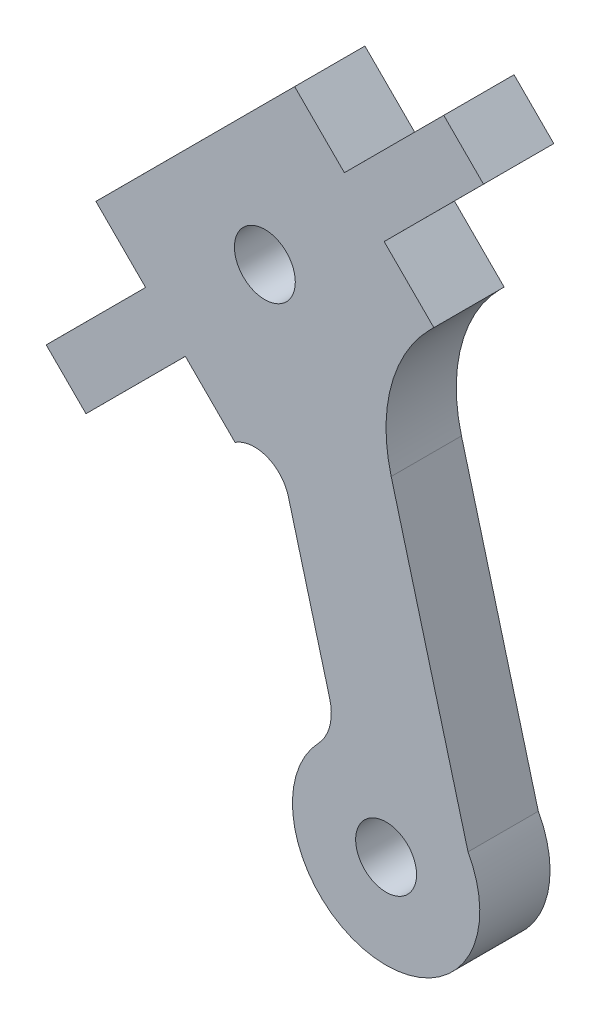
ISO-10303-21;
HEADER;
FILE_DESCRIPTION(('STEP AP214'),'2;1');
FILE_NAME('part.step','',(''),(''),'','','');
FILE_SCHEMA(('AUTOMOTIVE_DESIGN { 1 0 10303 214 1 1 1 1 }'));
ENDSEC;
DATA;
#1=APPLICATION_CONTEXT('core data for automotive mechanical design processes');
#2=APPLICATION_PROTOCOL_DEFINITION('international standard','automotive_design',2000,#1);
#3=PRODUCT_CONTEXT('',#1,'mechanical');
#4=PRODUCT('Part','Part','',(#3));
#5=PRODUCT_RELATED_PRODUCT_CATEGORY('part','',(#4));
#6=PRODUCT_DEFINITION_FORMATION('','',#4);
#7=PRODUCT_DEFINITION_CONTEXT('part definition',#1,'design');
#8=PRODUCT_DEFINITION('design','',#6,#7);
#9=PRODUCT_DEFINITION_SHAPE('','',#8);
#10=(LENGTH_UNIT() NAMED_UNIT(*) SI_UNIT(.MILLI.,.METRE.));
#11=(NAMED_UNIT(*) PLANE_ANGLE_UNIT() SI_UNIT($,.RADIAN.));
#12=(NAMED_UNIT(*) SI_UNIT($,.STERADIAN.) SOLID_ANGLE_UNIT());
#13=UNCERTAINTY_MEASURE_WITH_UNIT(LENGTH_MEASURE(1.E-05),#10,'distance_accuracy_value','');
#14=(GEOMETRIC_REPRESENTATION_CONTEXT(3) GLOBAL_UNCERTAINTY_ASSIGNED_CONTEXT((#13)) GLOBAL_UNIT_ASSIGNED_CONTEXT((#10,
#11,#12)) REPRESENTATION_CONTEXT('',''));
#15=CARTESIAN_POINT('',(0.,0.,0.));
#16=DIRECTION('',(0.,0.,1.));
#17=DIRECTION('',(1.,0.,0.));
#18=AXIS2_PLACEMENT_3D('',#15,#16,#17);
#19=CARTESIAN_POINT('',(8.71249984001849,3.27495155834081,-0.36285766747514));
#20=DIRECTION('',(0.,0.,-1.));
#21=DIRECTION('',(-1.,0.,0.));
#22=AXIS2_PLACEMENT_3D('',#19,#20,#21);
#23=CYLINDRICAL_SURFACE('',#22,3.9989046951601);
#24=CARTESIAN_POINT('',(8.71249984001849,3.27495155834081,-3.36285766747514));
#25=DIRECTION('',(0.,0.,-1.));
#26=DIRECTION('',(-1.,0.,0.));
#27=AXIS2_PLACEMENT_3D('',#24,#25,#26);
#28=CIRCLE('',#27,3.9989046951601);
#29=CARTESIAN_POINT('',(12.2085349080239,5.21633703378103,-3.36285766747514));
#30=VERTEX_POINT('',#29);
#31=CARTESIAN_POINT('',(5.81930803299026,6.03550946005528,-3.36285766747514));
#32=VERTEX_POINT('',#31);
#33=EDGE_CURVE('E193',#30,#32,#28,.T.);
#34=ORIENTED_EDGE('',*,*,#33,.F.);
#35=DIRECTION('',(0.,0.,-1.));
#36=VECTOR('',#35,1.);
#37=CARTESIAN_POINT('',(12.2085349080239,5.21633703378103,-0.36285766747514));
#38=LINE('',#37,#36);
#39=CARTESIAN_POINT('',(12.2085349080239,5.21633703378103,-0.36285766747514));
#40=VERTEX_POINT('',#39);
#41=EDGE_CURVE('E11',#40,#30,#38,.T.);
#42=ORIENTED_EDGE('',*,*,#41,.F.);
#43=CARTESIAN_POINT('',(8.71249984001849,3.27495155834081,-0.36285766747514));
#44=DIRECTION('',(0.,0.,-1.));
#45=DIRECTION('',(-1.,0.,0.));
#46=AXIS2_PLACEMENT_3D('',#43,#44,#45);
#47=CIRCLE('',#46,3.9989046951601);
#48=CARTESIAN_POINT('',(5.81930803299026,6.03550946005528,-0.36285766747514));
#49=VERTEX_POINT('',#48);
#50=EDGE_CURVE('E244',#40,#49,#47,.T.);
#51=ORIENTED_EDGE('',*,*,#50,.T.);
#52=DIRECTION('',(0.,0.,-1.));
#53=VECTOR('',#52,1.);
#54=CARTESIAN_POINT('',(5.81930803299026,6.03550946005528,-0.36285766747514));
#55=LINE('',#54,#53);
#56=EDGE_CURVE('E39',#49,#32,#55,.T.);
#57=ORIENTED_EDGE('',*,*,#56,.T.);
#58=EDGE_LOOP('',(#34,#42,#51,#57));
#59=FACE_BOUND('',#58,.T.);
#60=ADVANCED_FACE('F36',(#59),#23,.T.);
#61=CARTESIAN_POINT('',(8.92945698731412,17.453301020098,-0.36285766747514));
#62=DIRECTION('',(0.965922011606497,0.258833281272055,0.));
#63=DIRECTION('',(-0.258833281272055,0.965922011606497,0.));
#64=AXIS2_PLACEMENT_3D('',#61,#62,#63);
#65=PLANE('',#64);
#66=DIRECTION('',(0.258833281272055,-0.965922011606497,0.));
#67=VECTOR('',#66,1.);
#68=CARTESIAN_POINT('',(8.92945698731412,17.453301020098,-3.36285766747514));
#69=LINE('',#68,#67);
#70=CARTESIAN_POINT('',(8.92945698731412,17.453301020098,-3.36285766747514));
#71=VERTEX_POINT('',#70);
#72=EDGE_CURVE('E242',#71,#30,#69,.T.);
#73=ORIENTED_EDGE('',*,*,#72,.F.);
#74=DIRECTION('',(0.,0.,-1.));
#75=VECTOR('',#74,1.);
#76=CARTESIAN_POINT('',(8.92945698731412,17.453301020098,-0.36285766747514));
#77=LINE('',#76,#75);
#78=CARTESIAN_POINT('',(8.92945698731412,17.453301020098,-0.36285766747514));
#79=VERTEX_POINT('',#78);
#80=EDGE_CURVE('E45',#79,#71,#77,.T.);
#81=ORIENTED_EDGE('',*,*,#80,.F.);
#82=DIRECTION('',(0.258833281272055,-0.965922011606497,0.));
#83=VECTOR('',#82,1.);
#84=CARTESIAN_POINT('',(8.92945698731412,17.453301020098,-0.36285766747514));
#85=LINE('',#84,#83);
#86=EDGE_CURVE('E183',#79,#40,#85,.T.);
#87=ORIENTED_EDGE('',*,*,#86,.T.);
#88=ORIENTED_EDGE('',*,*,#41,.T.);
#89=EDGE_LOOP('',(#73,#81,#87,#88));
#90=FACE_BOUND('',#89,.T.);
#91=ADVANCED_FACE('F276',(#90),#65,.T.);
#92=CARTESIAN_POINT('',(15.2079500627494,19.1357173483645,-0.36285766747514));
#93=DIRECTION('',(0.,0.,-1.));
#94=DIRECTION('',(-1.,0.,0.));
#95=AXIS2_PLACEMENT_3D('',#92,#93,#94);
#96=CYLINDRICAL_SURFACE('',#95,6.49999999999285);
#97=CARTESIAN_POINT('',(15.2079500627494,19.1357173483645,-3.36285766747514));
#98=DIRECTION('',(0.,0.,1.));
#99=DIRECTION('',(1.,0.,0.));
#100=AXIS2_PLACEMENT_3D('',#97,#98,#99);
#101=CIRCLE('',#100,6.49999999999285);
#102=CARTESIAN_POINT('',(10.6110983109602,23.7312536578695,-3.36285766747514));
#103=VERTEX_POINT('',#102);
#104=EDGE_CURVE('E170',#103,#71,#101,.T.);
#105=ORIENTED_EDGE('',*,*,#104,.F.);
#106=DIRECTION('',(0.,0.,-1.));
#107=VECTOR('',#106,1.);
#108=CARTESIAN_POINT('',(10.6110983109602,23.7312536578695,-0.36285766747514));
#109=LINE('',#108,#107);
#110=CARTESIAN_POINT('',(10.6110983109602,23.7312536578695,-0.36285766747514));
#111=VERTEX_POINT('',#110);
#112=EDGE_CURVE('E165',#111,#103,#109,.T.);
#113=ORIENTED_EDGE('',*,*,#112,.F.);
#114=CARTESIAN_POINT('',(15.2079500627494,19.1357173483645,-0.36285766747514));
#115=DIRECTION('',(0.,0.,1.));
#116=DIRECTION('',(1.,0.,0.));
#117=AXIS2_PLACEMENT_3D('',#114,#115,#116);
#118=CIRCLE('',#117,6.49999999999285);
#119=EDGE_CURVE('E168',#111,#79,#118,.T.);
#120=ORIENTED_EDGE('',*,*,#119,.T.);
#121=ORIENTED_EDGE('',*,*,#80,.T.);
#122=EDGE_LOOP('',(#105,#113,#120,#121));
#123=FACE_BOUND('',#122,.T.);
#124=ADVANCED_FACE('F167',(#123),#96,.F.);
#125=CARTESIAN_POINT('',(10.750844377307,23.8674961610429,-0.36285766747514));
#126=DIRECTION('',(0.698074100813422,-0.716025523129959,0.));
#127=DIRECTION('',(0.716025523129959,0.698074100813422,0.));
#128=AXIS2_PLACEMENT_3D('',#125,#126,#127);
#129=PLANE('',#128);
#130=DIRECTION('',(-0.716025523129959,-0.698074100813422,0.));
#131=VECTOR('',#130,1.);
#132=CARTESIAN_POINT('',(10.750844377307,23.8674961610429,-3.36285766747514));
#133=LINE('',#132,#131);
#134=CARTESIAN_POINT('',(10.750844377307,23.8674961610429,-3.36285766747514));
#135=VERTEX_POINT('',#134);
#136=EDGE_CURVE('E239',#135,#103,#133,.T.);
#137=ORIENTED_EDGE('',*,*,#136,.F.);
#138=DIRECTION('',(0.,0.,-1.));
#139=VECTOR('',#138,1.);
#140=CARTESIAN_POINT('',(10.750844377307,23.8674961610429,-0.36285766747514));
#141=LINE('',#140,#139);
#142=CARTESIAN_POINT('',(10.750844377307,23.8674961610429,-0.36285766747514));
#143=VERTEX_POINT('',#142);
#144=EDGE_CURVE('E175',#143,#135,#141,.T.);
#145=ORIENTED_EDGE('',*,*,#144,.F.);
#146=DIRECTION('',(-0.716025523129959,-0.698074100813422,0.));
#147=VECTOR('',#146,1.);
#148=CARTESIAN_POINT('',(10.750844377307,23.8674961610429,-0.36285766747514));
#149=LINE('',#148,#147);
#150=EDGE_CURVE('E181',#143,#111,#149,.T.);
#151=ORIENTED_EDGE('',*,*,#150,.T.);
#152=ORIENTED_EDGE('',*,*,#112,.T.);
#153=EDGE_LOOP('',(#137,#145,#151,#152));
#154=FACE_BOUND('',#153,.T.);
#155=ADVANCED_FACE('F185',(#154),#129,.T.);
#156=CARTESIAN_POINT('',(8.62908040068246,25.9886529703706,-0.36285766747514));
#157=DIRECTION('',(0.707005586078472,0.707207961814512,0.));
#158=DIRECTION('',(-0.707207961814512,0.707005586078472,0.));
#159=AXIS2_PLACEMENT_3D('',#156,#157,#158);
#160=PLANE('',#159);
#161=DIRECTION('',(0.707207961814512,-0.707005586078473,0.));
#162=VECTOR('',#161,1.);
#163=CARTESIAN_POINT('',(8.62908040068246,25.9886529703706,-3.36285766747514));
#164=LINE('',#163,#162);
#165=CARTESIAN_POINT('',(8.62908040068246,25.9886529703706,-3.36285766747514));
#166=VERTEX_POINT('',#165);
#167=EDGE_CURVE('E236',#166,#135,#164,.T.);
#168=ORIENTED_EDGE('',*,*,#167,.F.);
#169=DIRECTION('',(0.,0.,-1.));
#170=VECTOR('',#169,1.);
#171=CARTESIAN_POINT('',(8.62908040068246,25.9886529703706,-0.36285766747514));
#172=LINE('',#171,#170);
#173=CARTESIAN_POINT('',(8.62908040068246,25.9886529703706,-0.36285766747514));
#174=VERTEX_POINT('',#173);
#175=EDGE_CURVE('E248',#174,#166,#172,.T.);
#176=ORIENTED_EDGE('',*,*,#175,.F.);
#177=DIRECTION('',(0.707207961814512,-0.707005586078473,0.));
#178=VECTOR('',#177,1.);
#179=CARTESIAN_POINT('',(8.62908040068246,25.9886529703706,-0.36285766747514));
#180=LINE('',#179,#178);
#181=EDGE_CURVE('E186',#174,#143,#180,.T.);
#182=ORIENTED_EDGE('',*,*,#181,.T.);
#183=ORIENTED_EDGE('',*,*,#144,.T.);
#184=EDGE_LOOP('',(#168,#176,#182,#183));
#185=FACE_BOUND('',#184,.T.);
#186=ADVANCED_FACE('F289',(#185),#160,.T.);
#187=CARTESIAN_POINT('',(12.8704287908277,30.2312154188192,-0.36285766747514));
#188=DIRECTION('',(0.707207961814511,-0.707005586078473,0.));
#189=DIRECTION('',(0.707005586078473,0.707207961814511,0.));
#190=AXIS2_PLACEMENT_3D('',#187,#188,#189);
#191=PLANE('',#190);
#192=DIRECTION('',(-0.707005586078473,-0.707207961814511,0.));
#193=VECTOR('',#192,1.);
#194=CARTESIAN_POINT('',(12.8704287908277,30.2312154188192,-3.36285766747514));
#195=LINE('',#194,#193);
#196=CARTESIAN_POINT('',(12.8704287908277,30.2312154188192,-3.36285766747514));
#197=VERTEX_POINT('',#196);
#198=EDGE_CURVE('E233',#197,#166,#195,.T.);
#199=ORIENTED_EDGE('',*,*,#198,.F.);
#200=DIRECTION('',(0.,0.,-1.));
#201=VECTOR('',#200,1.);
#202=CARTESIAN_POINT('',(12.8704287908277,30.2312154188192,-0.36285766747514));
#203=LINE('',#202,#201);
#204=CARTESIAN_POINT('',(12.8704287908277,30.2312154188192,-0.36285766747514));
#205=VERTEX_POINT('',#204);
#206=EDGE_CURVE('E250',#205,#197,#203,.T.);
#207=ORIENTED_EDGE('',*,*,#206,.F.);
#208=DIRECTION('',(-0.707005586078473,-0.707207961814511,0.));
#209=VECTOR('',#208,1.);
#210=CARTESIAN_POINT('',(12.8704287908277,30.2312154188192,-0.36285766747514));
#211=LINE('',#210,#209);
#212=EDGE_CURVE('E188',#205,#174,#211,.T.);
#213=ORIENTED_EDGE('',*,*,#212,.T.);
#214=ORIENTED_EDGE('',*,*,#175,.T.);
#215=EDGE_LOOP('',(#199,#207,#213,#214));
#216=FACE_BOUND('',#215,.T.);
#217=ADVANCED_FACE('F292',(#216),#191,.T.);
#218=CARTESIAN_POINT('',(11.1743183927104,31.9289847859676,-0.36285766747514));
#219=DIRECTION('',(0.70745233892217,0.706761054496886,0.));
#220=DIRECTION('',(-0.706761054496886,0.70745233892217,0.));
#221=AXIS2_PLACEMENT_3D('',#218,#219,#220);
#222=PLANE('',#221);
#223=DIRECTION('',(0.706761054496886,-0.70745233892217,0.));
#224=VECTOR('',#223,1.);
#225=CARTESIAN_POINT('',(11.1743183927104,31.9289847859676,-3.36285766747514));
#226=LINE('',#225,#224);
#227=CARTESIAN_POINT('',(11.1743183927104,31.9289847859676,-3.36285766747514));
#228=VERTEX_POINT('',#227);
#229=EDGE_CURVE('E230',#228,#197,#226,.T.);
#230=ORIENTED_EDGE('',*,*,#229,.F.);
#231=DIRECTION('',(0.,0.,-1.));
#232=VECTOR('',#231,1.);
#233=CARTESIAN_POINT('',(11.1743183927104,31.9289847859676,-0.36285766747514));
#234=LINE('',#233,#232);
#235=CARTESIAN_POINT('',(11.1743183927104,31.9289847859676,-0.36285766747514));
#236=VERTEX_POINT('',#235);
#237=EDGE_CURVE('E252',#236,#228,#234,.T.);
#238=ORIENTED_EDGE('',*,*,#237,.F.);
#239=DIRECTION('',(0.706761054496886,-0.70745233892217,0.));
#240=VECTOR('',#239,1.);
#241=CARTESIAN_POINT('',(11.1743183927104,31.9289847859676,-0.36285766747514));
#242=LINE('',#241,#240);
#243=EDGE_CURVE('E408',#236,#205,#242,.T.);
#244=ORIENTED_EDGE('',*,*,#243,.T.);
#245=ORIENTED_EDGE('',*,*,#206,.T.);
#246=EDGE_LOOP('',(#230,#238,#244,#245));
#247=FACE_BOUND('',#246,.T.);
#248=ADVANCED_FACE('F296',(#247),#222,.T.);
#249=CARTESIAN_POINT('',(6.93196836559379,27.6854204138356,-0.36285766747514));
#250=DIRECTION('',(-0.707207961814513,0.707005586078471,0.));
#251=DIRECTION('',(-0.707005586078471,-0.707207961814513,0.));
#252=AXIS2_PLACEMENT_3D('',#249,#250,#251);
#253=PLANE('',#252);
#254=DIRECTION('',(0.707005586078472,0.707207961814513,0.));
#255=VECTOR('',#254,1.);
#256=CARTESIAN_POINT('',(6.93196836559379,27.6854204138356,-3.36285766747514));
#257=LINE('',#256,#255);
#258=CARTESIAN_POINT('',(6.93196836559379,27.6854204138356,-3.36285766747514));
#259=VERTEX_POINT('',#258);
#260=EDGE_CURVE('E227',#259,#228,#257,.T.);
#261=ORIENTED_EDGE('',*,*,#260,.F.);
#262=DIRECTION('',(0.,0.,-1.));
#263=VECTOR('',#262,1.);
#264=CARTESIAN_POINT('',(6.93196836559379,27.6854204138356,-0.36285766747514));
#265=LINE('',#264,#263);
#266=CARTESIAN_POINT('',(6.93196836559379,27.6854204138356,-0.36285766747514));
#267=VERTEX_POINT('',#266);
#268=EDGE_CURVE('E254',#267,#259,#265,.T.);
#269=ORIENTED_EDGE('',*,*,#268,.F.);
#270=DIRECTION('',(0.707005586078472,0.707207961814513,0.));
#271=VECTOR('',#270,1.);
#272=CARTESIAN_POINT('',(6.93196836559379,27.6854204138356,-0.36285766747514));
#273=LINE('',#272,#271);
#274=EDGE_CURVE('E405',#267,#236,#273,.T.);
#275=ORIENTED_EDGE('',*,*,#274,.T.);
#276=ORIENTED_EDGE('',*,*,#237,.T.);
#277=EDGE_LOOP('',(#261,#269,#275,#276));
#278=FACE_BOUND('',#277,.T.);
#279=ADVANCED_FACE('F300',(#278),#253,.T.);
#280=CARTESIAN_POINT('',(4.80844312338478,29.8083379847412,-0.36285766747514));
#281=DIRECTION('',(0.707005586078472,0.707207961814512,0.));
#282=DIRECTION('',(-0.707207961814512,0.707005586078472,0.));
#283=AXIS2_PLACEMENT_3D('',#280,#281,#282);
#284=PLANE('',#283);
#285=DIRECTION('',(0.707207961814512,-0.707005586078472,0.));
#286=VECTOR('',#285,1.);
#287=CARTESIAN_POINT('',(4.80844312338478,29.8083379847412,-3.36285766747514));
#288=LINE('',#287,#286);
#289=CARTESIAN_POINT('',(4.80844312338478,29.8083379847412,-3.36285766747514));
#290=VERTEX_POINT('',#289);
#291=EDGE_CURVE('E224',#290,#259,#288,.T.);
#292=ORIENTED_EDGE('',*,*,#291,.F.);
#293=DIRECTION('',(0.,0.,-1.));
#294=VECTOR('',#293,1.);
#295=CARTESIAN_POINT('',(4.80844312338478,29.8083379847412,-0.36285766747514));
#296=LINE('',#295,#294);
#297=CARTESIAN_POINT('',(4.80844312338478,29.8083379847412,-0.36285766747514));
#298=VERTEX_POINT('',#297);
#299=EDGE_CURVE('E256',#298,#290,#296,.T.);
#300=ORIENTED_EDGE('',*,*,#299,.F.);
#301=DIRECTION('',(0.707207961814512,-0.707005586078472,0.));
#302=VECTOR('',#301,1.);
#303=CARTESIAN_POINT('',(4.80844312338478,29.8083379847412,-0.36285766747514));
#304=LINE('',#303,#302);
#305=EDGE_CURVE('E402',#298,#267,#304,.T.);
#306=ORIENTED_EDGE('',*,*,#305,.T.);
#307=ORIENTED_EDGE('',*,*,#268,.T.);
#308=EDGE_LOOP('',(#292,#300,#306,#307));
#309=FACE_BOUND('',#308,.T.);
#310=ADVANCED_FACE('F304',(#309),#284,.T.);
#311=CARTESIAN_POINT('',(-3.67577878066778,21.3216875275253,-0.36285766747514));
#312=DIRECTION('',(-0.707207961814512,0.707005586078472,0.));
#313=DIRECTION('',(-0.707005586078472,-0.707207961814512,0.));
#314=AXIS2_PLACEMENT_3D('',#311,#312,#313);
#315=PLANE('',#314);
#316=DIRECTION('',(0.707005586078472,0.707207961814512,0.));
#317=VECTOR('',#316,1.);
#318=CARTESIAN_POINT('',(-3.67577878066778,21.3216875275253,-3.36285766747514));
#319=LINE('',#318,#317);
#320=CARTESIAN_POINT('',(-3.67577878066778,21.3216875275253,-3.36285766747514));
#321=VERTEX_POINT('',#320);
#322=EDGE_CURVE('E221',#321,#290,#319,.T.);
#323=ORIENTED_EDGE('',*,*,#322,.F.);
#324=DIRECTION('',(0.,0.,-1.));
#325=VECTOR('',#324,1.);
#326=CARTESIAN_POINT('',(-3.67577878066778,21.3216875275253,-0.36285766747514));
#327=LINE('',#326,#325);
#328=CARTESIAN_POINT('',(-3.67577878066778,21.3216875275253,-0.36285766747514));
#329=VERTEX_POINT('',#328);
#330=EDGE_CURVE('E258',#329,#321,#327,.T.);
#331=ORIENTED_EDGE('',*,*,#330,.F.);
#332=DIRECTION('',(0.707005586078472,0.707207961814512,0.));
#333=VECTOR('',#332,1.);
#334=CARTESIAN_POINT('',(-3.67577878066778,21.3216875275253,-0.36285766747514));
#335=LINE('',#334,#333);
#336=EDGE_CURVE('E399',#329,#298,#335,.T.);
#337=ORIENTED_EDGE('',*,*,#336,.T.);
#338=ORIENTED_EDGE('',*,*,#299,.T.);
#339=EDGE_LOOP('',(#323,#331,#337,#338));
#340=FACE_BOUND('',#339,.T.);
#341=ADVANCED_FACE('F308',(#340),#315,.T.);
#342=CARTESIAN_POINT('',(-1.55401480404322,19.2005307181976,-0.36285766747514));
#343=DIRECTION('',(-0.707005586078472,-0.707207961814512,0.));
#344=DIRECTION('',(0.707207961814512,-0.707005586078472,0.));
#345=AXIS2_PLACEMENT_3D('',#342,#343,#344);
#346=PLANE('',#345);
#347=DIRECTION('',(-0.707207961814512,0.707005586078472,0.));
#348=VECTOR('',#347,1.);
#349=CARTESIAN_POINT('',(-1.55401480404322,19.2005307181976,-3.36285766747514));
#350=LINE('',#349,#348);
#351=CARTESIAN_POINT('',(-1.55401480404322,19.2005307181976,-3.36285766747514));
#352=VERTEX_POINT('',#351);
#353=EDGE_CURVE('E218',#352,#321,#350,.T.);
#354=ORIENTED_EDGE('',*,*,#353,.F.);
#355=DIRECTION('',(0.,0.,-1.));
#356=VECTOR('',#355,1.);
#357=CARTESIAN_POINT('',(-1.55401480404322,19.2005307181976,-0.36285766747514));
#358=LINE('',#357,#356);
#359=CARTESIAN_POINT('',(-1.55401480404322,19.2005307181976,-0.36285766747514));
#360=VERTEX_POINT('',#359);
#361=EDGE_CURVE('E260',#360,#352,#358,.T.);
#362=ORIENTED_EDGE('',*,*,#361,.F.);
#363=DIRECTION('',(-0.707207961814512,0.707005586078472,0.));
#364=VECTOR('',#363,1.);
#365=CARTESIAN_POINT('',(-1.55401480404322,19.2005307181976,-0.36285766747514));
#366=LINE('',#365,#364);
#367=EDGE_CURVE('E396',#360,#329,#366,.T.);
#368=ORIENTED_EDGE('',*,*,#367,.T.);
#369=ORIENTED_EDGE('',*,*,#330,.T.);
#370=EDGE_LOOP('',(#354,#362,#368,#369));
#371=FACE_BOUND('',#370,.T.);
#372=ADVANCED_FACE('F312',(#371),#346,.T.);
#373=CARTESIAN_POINT('',(-5.79699164607409,14.9563393517297,-0.36285766747514));
#374=DIRECTION('',(-0.707207961814512,0.707005586078472,0.));
#375=DIRECTION('',(-0.707005586078472,-0.707207961814512,0.));
#376=AXIS2_PLACEMENT_3D('',#373,#374,#375);
#377=PLANE('',#376);
#378=DIRECTION('',(0.707005586078472,0.707207961814512,0.));
#379=VECTOR('',#378,1.);
#380=CARTESIAN_POINT('',(-5.79699164607409,14.9563393517297,-3.36285766747514));
#381=LINE('',#380,#379);
#382=CARTESIAN_POINT('',(-5.79699164607409,14.9563393517297,-3.36285766747514));
#383=VERTEX_POINT('',#382);
#384=EDGE_CURVE('E215',#383,#352,#381,.T.);
#385=ORIENTED_EDGE('',*,*,#384,.F.);
#386=DIRECTION('',(0.,0.,-1.));
#387=VECTOR('',#386,1.);
#388=CARTESIAN_POINT('',(-5.79699164607409,14.9563393517297,-0.36285766747514));
#389=LINE('',#388,#387);
#390=CARTESIAN_POINT('',(-5.79699164607409,14.9563393517297,-0.36285766747514));
#391=VERTEX_POINT('',#390);
#392=EDGE_CURVE('E262',#391,#383,#389,.T.);
#393=ORIENTED_EDGE('',*,*,#392,.F.);
#394=DIRECTION('',(0.707005586078472,0.707207961814512,0.));
#395=VECTOR('',#394,1.);
#396=CARTESIAN_POINT('',(-5.79699164607409,14.9563393517297,-0.36285766747514));
#397=LINE('',#396,#395);
#398=EDGE_CURVE('E393',#391,#360,#397,.T.);
#399=ORIENTED_EDGE('',*,*,#398,.T.);
#400=ORIENTED_EDGE('',*,*,#361,.T.);
#401=EDGE_LOOP('',(#385,#393,#399,#400));
#402=FACE_BOUND('',#401,.T.);
#403=ADVANCED_FACE('F316',(#402),#377,.T.);
#404=CARTESIAN_POINT('',(-4.09981959930552,13.2596529703675,-0.36285766747514));
#405=DIRECTION('',(-0.707005586078472,-0.707207961814512,0.));
#406=DIRECTION('',(0.707207961814512,-0.707005586078472,0.));
#407=AXIS2_PLACEMENT_3D('',#404,#405,#406);
#408=PLANE('',#407);
#409=DIRECTION('',(-0.707207961814512,0.707005586078472,0.));
#410=VECTOR('',#409,1.);
#411=CARTESIAN_POINT('',(-4.09981959930552,13.2596529703675,-3.36285766747514));
#412=LINE('',#411,#410);
#413=CARTESIAN_POINT('',(-4.09981959930552,13.2596529703675,-3.36285766747514));
#414=VERTEX_POINT('',#413);
#415=EDGE_CURVE('E212',#414,#383,#412,.T.);
#416=ORIENTED_EDGE('',*,*,#415,.F.);
#417=DIRECTION('',(0.,0.,-1.));
#418=VECTOR('',#417,1.);
#419=CARTESIAN_POINT('',(-4.09981959930552,13.2596529703675,-0.36285766747514));
#420=LINE('',#419,#418);
#421=CARTESIAN_POINT('',(-4.09981959930552,13.2596529703675,-0.36285766747514));
#422=VERTEX_POINT('',#421);
#423=EDGE_CURVE('E264',#422,#414,#420,.T.);
#424=ORIENTED_EDGE('',*,*,#423,.F.);
#425=DIRECTION('',(-0.707207961814512,0.707005586078472,0.));
#426=VECTOR('',#425,1.);
#427=CARTESIAN_POINT('',(-4.09981959930552,13.2596529703675,-0.36285766747514));
#428=LINE('',#427,#426);
#429=EDGE_CURVE('E390',#422,#391,#428,.T.);
#430=ORIENTED_EDGE('',*,*,#429,.T.);
#431=ORIENTED_EDGE('',*,*,#392,.T.);
#432=EDGE_LOOP('',(#416,#424,#430,#431));
#433=FACE_BOUND('',#432,.T.);
#434=ADVANCED_FACE('F320',(#433),#408,.T.);
#435=CARTESIAN_POINT('',(0.142530427811135,17.5032173424995,-0.36285766747514));
#436=DIRECTION('',(0.707207961814512,-0.707005586078472,0.));
#437=DIRECTION('',(0.707005586078472,0.707207961814512,0.));
#438=AXIS2_PLACEMENT_3D('',#435,#436,#437);
#439=PLANE('',#438);
#440=DIRECTION('',(-0.707005586078472,-0.707207961814512,0.));
#441=VECTOR('',#440,1.);
#442=CARTESIAN_POINT('',(0.142530427811135,17.5032173424995,-3.36285766747514));
#443=LINE('',#442,#441);
#444=CARTESIAN_POINT('',(0.142530427811135,17.5032173424995,-3.36285766747514));
#445=VERTEX_POINT('',#444);
#446=EDGE_CURVE('E209',#445,#414,#443,.T.);
#447=ORIENTED_EDGE('',*,*,#446,.F.);
#448=DIRECTION('',(0.,0.,-1.));
#449=VECTOR('',#448,1.);
#450=CARTESIAN_POINT('',(0.142530427811135,17.5032173424995,-0.36285766747514));
#451=LINE('',#450,#449);
#452=CARTESIAN_POINT('',(0.142530427811135,17.5032173424995,-0.36285766747514));
#453=VERTEX_POINT('',#452);
#454=EDGE_CURVE('E266',#453,#445,#451,.T.);
#455=ORIENTED_EDGE('',*,*,#454,.F.);
#456=DIRECTION('',(-0.707005586078472,-0.707207961814512,0.));
#457=VECTOR('',#456,1.);
#458=CARTESIAN_POINT('',(0.142530427811135,17.5032173424995,-0.36285766747514));
#459=LINE('',#458,#457);
#460=EDGE_CURVE('E387',#453,#422,#459,.T.);
#461=ORIENTED_EDGE('',*,*,#460,.T.);
#462=ORIENTED_EDGE('',*,*,#423,.T.);
#463=EDGE_LOOP('',(#447,#455,#461,#462));
#464=FACE_BOUND('',#463,.T.);
#465=ADVANCED_FACE('F324',(#464),#439,.T.);
#466=CARTESIAN_POINT('',(2.26429440442557,15.3820605331819,-0.36285766747514));
#467=DIRECTION('',(-0.707005586078472,-0.707207961814512,0.));
#468=DIRECTION('',(0.707207961814512,-0.707005586078472,0.));
#469=AXIS2_PLACEMENT_3D('',#466,#467,#468);
#470=PLANE('',#469);
#471=DIRECTION('',(-0.707207961814512,0.707005586078472,0.));
#472=VECTOR('',#471,1.);
#473=CARTESIAN_POINT('',(2.26429440442557,15.3820605331819,-3.36285766747514));
#474=LINE('',#473,#472);
#475=CARTESIAN_POINT('',(2.26429440442557,15.3820605331819,-3.36285766747514));
#476=VERTEX_POINT('',#475);
#477=EDGE_CURVE('E206',#476,#445,#474,.T.);
#478=ORIENTED_EDGE('',*,*,#477,.F.);
#479=DIRECTION('',(0.,0.,-1.));
#480=VECTOR('',#479,1.);
#481=CARTESIAN_POINT('',(2.26429440442557,15.3820605331819,-0.36285766747514));
#482=LINE('',#481,#480);
#483=CARTESIAN_POINT('',(2.26429440442557,15.3820605331819,-0.36285766747514));
#484=VERTEX_POINT('',#483);
#485=EDGE_CURVE('E268',#484,#476,#482,.T.);
#486=ORIENTED_EDGE('',*,*,#485,.F.);
#487=DIRECTION('',(-0.707207961814512,0.707005586078472,0.));
#488=VECTOR('',#487,1.);
#489=CARTESIAN_POINT('',(2.26429440442557,15.3820605331819,-0.36285766747514));
#490=LINE('',#489,#488);
#491=EDGE_CURVE('E384',#484,#453,#490,.T.);
#492=ORIENTED_EDGE('',*,*,#491,.T.);
#493=ORIENTED_EDGE('',*,*,#454,.T.);
#494=EDGE_LOOP('',(#478,#486,#492,#493));
#495=FACE_BOUND('',#494,.T.);
#496=ADVANCED_FACE('F328',(#495),#470,.T.);
#497=CARTESIAN_POINT('',(3.09080137363504,14.1303072708142,-0.36285766747514));
#498=DIRECTION('',(0.,0.,-1.));
#499=DIRECTION('',(-1.,0.,0.));
#500=AXIS2_PLACEMENT_3D('',#497,#498,#499);
#501=CYLINDRICAL_SURFACE('',#500,1.5);
#502=CARTESIAN_POINT('',(3.09080137363504,14.1303072708142,-3.36285766747514));
#503=DIRECTION('',(0.,0.,1.));
#504=DIRECTION('',(1.,0.,0.));
#505=AXIS2_PLACEMENT_3D('',#502,#503,#504);
#506=CIRCLE('',#505,1.5);
#507=CARTESIAN_POINT('',(4.53968439104478,14.5185571927223,-3.36285766747514));
#508=VERTEX_POINT('',#507);
#509=EDGE_CURVE('E203',#508,#476,#506,.T.);
#510=ORIENTED_EDGE('',*,*,#509,.F.);
#511=DIRECTION('',(0.,0.,-1.));
#512=VECTOR('',#511,1.);
#513=CARTESIAN_POINT('',(4.53968439104478,14.5185571927223,-0.36285766747514));
#514=LINE('',#513,#512);
#515=CARTESIAN_POINT('',(4.53968439104478,14.5185571927223,-0.36285766747514));
#516=VERTEX_POINT('',#515);
#517=EDGE_CURVE('E270',#516,#508,#514,.T.);
#518=ORIENTED_EDGE('',*,*,#517,.F.);
#519=CARTESIAN_POINT('',(3.09080137363504,14.1303072708142,-0.36285766747514));
#520=DIRECTION('',(0.,0.,1.));
#521=DIRECTION('',(1.,0.,0.));
#522=AXIS2_PLACEMENT_3D('',#519,#520,#521);
#523=CIRCLE('',#522,1.5);
#524=EDGE_CURVE('E381',#516,#484,#523,.T.);
#525=ORIENTED_EDGE('',*,*,#524,.T.);
#526=ORIENTED_EDGE('',*,*,#485,.T.);
#527=EDGE_LOOP('',(#510,#518,#525,#526));
#528=FACE_BOUND('',#527,.T.);
#529=ADVANCED_FACE('F332',(#528),#501,.F.);
#530=CARTESIAN_POINT('',(6.3041599283189,7.9338330335332,-0.36285766747514));
#531=DIRECTION('',(-0.965922011606497,-0.258833281272055,0.));
#532=DIRECTION('',(0.258833281272055,-0.965922011606497,0.));
#533=AXIS2_PLACEMENT_3D('',#530,#531,#532);
#534=PLANE('',#533);
#535=DIRECTION('',(-0.258833281272055,0.965922011606497,0.));
#536=VECTOR('',#535,1.);
#537=CARTESIAN_POINT('',(6.3041599283189,7.9338330335332,-3.36285766747514));
#538=LINE('',#537,#536);
#539=CARTESIAN_POINT('',(6.3041599283189,7.9338330335332,-3.36285766747514));
#540=VERTEX_POINT('',#539);
#541=EDGE_CURVE('E200',#540,#508,#538,.T.);
#542=ORIENTED_EDGE('',*,*,#541,.F.);
#543=DIRECTION('',(0.,0.,-1.));
#544=VECTOR('',#543,1.);
#545=CARTESIAN_POINT('',(6.3041599283189,7.9338330335332,-0.36285766747514));
#546=LINE('',#545,#544);
#547=CARTESIAN_POINT('',(6.3041599283189,7.9338330335332,-0.36285766747514));
#548=VERTEX_POINT('',#547);
#549=EDGE_CURVE('E271',#548,#540,#546,.T.);
#550=ORIENTED_EDGE('',*,*,#549,.F.);
#551=DIRECTION('',(-0.258833281272055,0.965922011606497,0.));
#552=VECTOR('',#551,1.);
#553=CARTESIAN_POINT('',(6.3041599283189,7.9338330335332,-0.36285766747514));
#554=LINE('',#553,#552);
#555=EDGE_CURVE('E378',#548,#516,#554,.T.);
#556=ORIENTED_EDGE('',*,*,#555,.T.);
#557=ORIENTED_EDGE('',*,*,#517,.T.);
#558=EDGE_LOOP('',(#542,#550,#556,#557));
#559=FACE_BOUND('',#558,.T.);
#560=ADVANCED_FACE('F336',(#559),#534,.T.);
#561=CARTESIAN_POINT('',(4.37231590510591,7.41616647098909,-0.36285766747514));
#562=DIRECTION('',(0.,0.,-1.));
#563=DIRECTION('',(-1.,0.,0.));
#564=AXIS2_PLACEMENT_3D('',#561,#562,#563);
#565=CYLINDRICAL_SURFACE('',#564,2.);
#566=CARTESIAN_POINT('',(4.37231590510591,7.41616647098909,-3.36285766747514));
#567=DIRECTION('',(0.,0.,1.));
#568=DIRECTION('',(1.,0.,0.));
#569=AXIS2_PLACEMENT_3D('',#566,#567,#568);
#570=CIRCLE('',#569,2.);
#571=EDGE_CURVE('E196',#32,#540,#570,.T.);
#572=ORIENTED_EDGE('',*,*,#571,.F.);
#573=ORIENTED_EDGE('',*,*,#56,.F.);
#574=CARTESIAN_POINT('',(4.37231590510591,7.41616647098909,-0.36285766747514));
#575=DIRECTION('',(0.,0.,1.));
#576=DIRECTION('',(1.,0.,0.));
#577=AXIS2_PLACEMENT_3D('',#574,#575,#576);
#578=CIRCLE('',#577,2.);
#579=EDGE_CURVE('E376',#49,#548,#578,.T.);
#580=ORIENTED_EDGE('',*,*,#579,.T.);
#581=ORIENTED_EDGE('',*,*,#549,.T.);
#582=EDGE_LOOP('',(#572,#573,#580,#581));
#583=FACE_BOUND('',#582,.T.);
#584=ADVANCED_FACE('F273',(#583),#565,.F.);
#585=CARTESIAN_POINT('',(8.71249984001849,3.27495155834081,-0.36285766747514));
#586=DIRECTION('',(0.,0.,-1.));
#587=DIRECTION('',(-1.,0.,0.));
#588=AXIS2_PLACEMENT_3D('',#585,#586,#587);
#589=PLANE('',#588);
#590=CARTESIAN_POINT('',(3.53656757422475,22.5939838241258,-0.36285766747514));
#591=DIRECTION('',(0.,0.,-1.));
#592=DIRECTION('',(1.,0.,0.));
#593=AXIS2_PLACEMENT_3D('',#590,#591,#592);
#594=CIRCLE('',#593,1.3);
#595=CARTESIAN_POINT('',(4.83656757422475,22.5939838241258,-0.36285766747514));
#596=VERTEX_POINT('',#595);
#597=EDGE_CURVE('E363',#596,#596,#594,.T.);
#598=ORIENTED_EDGE('',*,*,#597,.T.);
#599=EDGE_LOOP('',(#598));
#600=FACE_BOUND('',#599,.T.);
#601=CARTESIAN_POINT('',(8.71249984001849,3.27495155834081,-0.36285766747514));
#602=DIRECTION('',(0.,0.,-1.));
#603=DIRECTION('',(1.,0.,0.));
#604=AXIS2_PLACEMENT_3D('',#601,#602,#603);
#605=CIRCLE('',#604,1.29999999998934);
#606=CARTESIAN_POINT('',(10.0124998400078,3.27495155834081,-0.36285766747514));
#607=VERTEX_POINT('',#606);
#608=EDGE_CURVE('E197',#607,#607,#605,.T.);
#609=ORIENTED_EDGE('',*,*,#608,.T.);
#610=EDGE_LOOP('',(#609));
#611=FACE_BOUND('',#610,.T.);
#612=ORIENTED_EDGE('',*,*,#50,.F.);
#613=ORIENTED_EDGE('',*,*,#86,.F.);
#614=ORIENTED_EDGE('',*,*,#119,.F.);
#615=ORIENTED_EDGE('',*,*,#150,.F.);
#616=ORIENTED_EDGE('',*,*,#181,.F.);
#617=ORIENTED_EDGE('',*,*,#212,.F.);
#618=ORIENTED_EDGE('',*,*,#243,.F.);
#619=ORIENTED_EDGE('',*,*,#274,.F.);
#620=ORIENTED_EDGE('',*,*,#305,.F.);
#621=ORIENTED_EDGE('',*,*,#336,.F.);
#622=ORIENTED_EDGE('',*,*,#367,.F.);
#623=ORIENTED_EDGE('',*,*,#398,.F.);
#624=ORIENTED_EDGE('',*,*,#429,.F.);
#625=ORIENTED_EDGE('',*,*,#460,.F.);
#626=ORIENTED_EDGE('',*,*,#491,.F.);
#627=ORIENTED_EDGE('',*,*,#524,.F.);
#628=ORIENTED_EDGE('',*,*,#555,.F.);
#629=ORIENTED_EDGE('',*,*,#579,.F.);
#630=EDGE_LOOP('',(#612,#613,#614,#615,#616,#617,#618,#619,#620,#621,#622,#623,#624,#625,#626,
#627,#628,#629));
#631=FACE_BOUND('',#630,.T.);
#632=ADVANCED_FACE('F179',(#600,#611,#631),#589,.F.);
#633=CARTESIAN_POINT('',(8.71249984001849,3.27495155834081,-3.36285766747514));
#634=DIRECTION('',(0.,0.,-1.));
#635=DIRECTION('',(-1.,0.,0.));
#636=AXIS2_PLACEMENT_3D('',#633,#634,#635);
#637=PLANE('',#636);
#638=CARTESIAN_POINT('',(3.53656757422475,22.5939838241258,-3.36285766747514));
#639=DIRECTION('',(0.,0.,-1.));
#640=DIRECTION('',(1.,0.,0.));
#641=AXIS2_PLACEMENT_3D('',#638,#639,#640);
#642=CIRCLE('',#641,1.3);
#643=CARTESIAN_POINT('',(4.83656757422475,22.5939838241258,-3.36285766747514));
#644=VERTEX_POINT('',#643);
#645=EDGE_CURVE('E366',#644,#644,#642,.T.);
#646=ORIENTED_EDGE('',*,*,#645,.F.);
#647=EDGE_LOOP('',(#646));
#648=FACE_BOUND('',#647,.T.);
#649=CARTESIAN_POINT('',(8.71249984001849,3.27495155834081,-3.36285766747514));
#650=DIRECTION('',(0.,0.,-1.));
#651=DIRECTION('',(1.,0.,0.));
#652=AXIS2_PLACEMENT_3D('',#649,#650,#651);
#653=CIRCLE('',#652,1.29999999998934);
#654=CARTESIAN_POINT('',(10.0124998400078,3.27495155834081,-3.36285766747514));
#655=VERTEX_POINT('',#654);
#656=EDGE_CURVE('E368',#655,#655,#653,.T.);
#657=ORIENTED_EDGE('',*,*,#656,.F.);
#658=EDGE_LOOP('',(#657));
#659=FACE_BOUND('',#658,.T.);
#660=ORIENTED_EDGE('',*,*,#33,.T.);
#661=ORIENTED_EDGE('',*,*,#571,.T.);
#662=ORIENTED_EDGE('',*,*,#541,.T.);
#663=ORIENTED_EDGE('',*,*,#509,.T.);
#664=ORIENTED_EDGE('',*,*,#477,.T.);
#665=ORIENTED_EDGE('',*,*,#446,.T.);
#666=ORIENTED_EDGE('',*,*,#415,.T.);
#667=ORIENTED_EDGE('',*,*,#384,.T.);
#668=ORIENTED_EDGE('',*,*,#353,.T.);
#669=ORIENTED_EDGE('',*,*,#322,.T.);
#670=ORIENTED_EDGE('',*,*,#291,.T.);
#671=ORIENTED_EDGE('',*,*,#260,.T.);
#672=ORIENTED_EDGE('',*,*,#229,.T.);
#673=ORIENTED_EDGE('',*,*,#198,.T.);
#674=ORIENTED_EDGE('',*,*,#167,.T.);
#675=ORIENTED_EDGE('',*,*,#136,.T.);
#676=ORIENTED_EDGE('',*,*,#104,.T.);
#677=ORIENTED_EDGE('',*,*,#72,.T.);
#678=EDGE_LOOP('',(#660,#661,#662,#663,#664,#665,#666,#667,#668,#669,#670,#671,#672,#673,#674,
#675,#676,#677));
#679=FACE_BOUND('',#678,.T.);
#680=ADVANCED_FACE('F275',(#648,#659,#679),#637,.T.);
#681=CARTESIAN_POINT('',(8.71249984001849,3.27495155834081,-0.36285766747514));
#682=DIRECTION('',(0.,0.,-1.));
#683=DIRECTION('',(-1.,0.,0.));
#684=AXIS2_PLACEMENT_3D('',#681,#682,#683);
#685=CYLINDRICAL_SURFACE('',#684,1.29999999998934);
#686=ORIENTED_EDGE('',*,*,#608,.F.);
#687=EDGE_LOOP('',(#686));
#688=FACE_BOUND('',#687,.T.);
#689=ORIENTED_EDGE('',*,*,#656,.T.);
#690=EDGE_LOOP('',(#689));
#691=FACE_BOUND('',#690,.T.);
#692=ADVANCED_FACE('F348',(#688,#691),#685,.F.);
#693=CARTESIAN_POINT('',(3.53656757422475,22.5939838241258,-0.36285766747514));
#694=DIRECTION('',(0.,0.,-1.));
#695=DIRECTION('',(-1.,0.,0.));
#696=AXIS2_PLACEMENT_3D('',#693,#694,#695);
#697=CYLINDRICAL_SURFACE('',#696,1.3);
#698=ORIENTED_EDGE('',*,*,#597,.F.);
#699=EDGE_LOOP('',(#698));
#700=FACE_BOUND('',#699,.T.);
#701=ORIENTED_EDGE('',*,*,#645,.T.);
#702=EDGE_LOOP('',(#701));
#703=FACE_BOUND('',#702,.T.);
#704=ADVANCED_FACE('F355',(#700,#703),#697,.F.);
#705=CLOSED_SHELL('',(#60,#91,#124,#155,#186,#217,#248,#279,#310,#341,#372,#403,#434,#465,#496,
#529,#560,#584,#632,#680,#692,#704));
#706=MANIFOLD_SOLID_BREP('B2',#705);
#707=ADVANCED_BREP_SHAPE_REPRESENTATION('',(#18,#706),#14);
#708=SHAPE_DEFINITION_REPRESENTATION(#9,#707);
ENDSEC;
END-ISO-10303-21;
